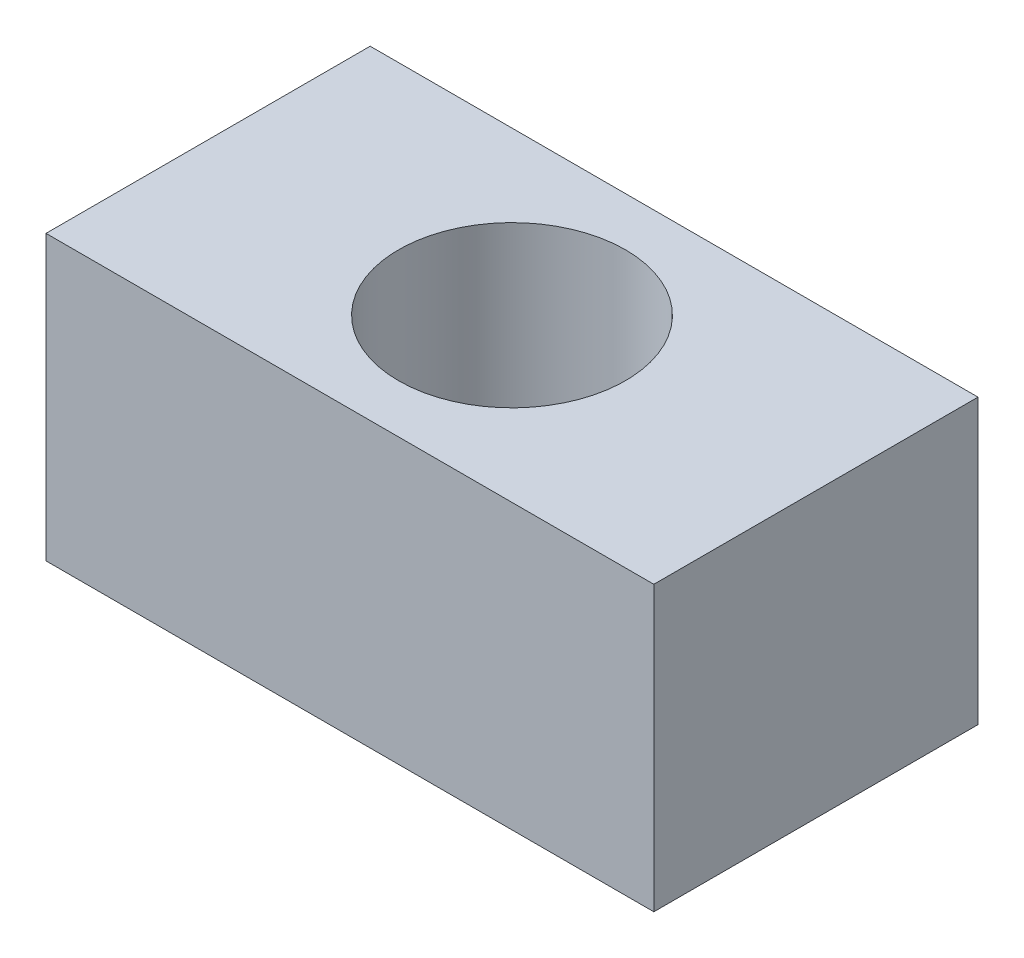
ISO-10303-21;
HEADER;
FILE_DESCRIPTION(('STEP AP214'),'2;1');
FILE_NAME('part.step','',(''),(''),'','','');
FILE_SCHEMA(('AUTOMOTIVE_DESIGN { 1 0 10303 214 1 1 1 1 }'));
ENDSEC;
DATA;
#1=APPLICATION_CONTEXT('core data for automotive mechanical design processes');
#2=APPLICATION_PROTOCOL_DEFINITION('international standard','automotive_design',2000,#1);
#3=PRODUCT_CONTEXT('',#1,'mechanical');
#4=PRODUCT('Part','Part','',(#3));
#5=PRODUCT_RELATED_PRODUCT_CATEGORY('part','',(#4));
#6=PRODUCT_DEFINITION_FORMATION('','',#4);
#7=PRODUCT_DEFINITION_CONTEXT('part definition',#1,'design');
#8=PRODUCT_DEFINITION('design','',#6,#7);
#9=PRODUCT_DEFINITION_SHAPE('','',#8);
#10=(LENGTH_UNIT() NAMED_UNIT(*) SI_UNIT(.MILLI.,.METRE.));
#11=(NAMED_UNIT(*) PLANE_ANGLE_UNIT() SI_UNIT($,.RADIAN.));
#12=(NAMED_UNIT(*) SI_UNIT($,.STERADIAN.) SOLID_ANGLE_UNIT());
#13=UNCERTAINTY_MEASURE_WITH_UNIT(LENGTH_MEASURE(1.E-05),#10,'distance_accuracy_value','');
#14=(GEOMETRIC_REPRESENTATION_CONTEXT(3) GLOBAL_UNCERTAINTY_ASSIGNED_CONTEXT((#13)) GLOBAL_UNIT_ASSIGNED_CONTEXT((#10,
#11,#12)) REPRESENTATION_CONTEXT('',''));
#15=CARTESIAN_POINT('',(0.,0.,0.));
#16=DIRECTION('',(0.,0.,1.));
#17=DIRECTION('',(1.,0.,0.));
#18=AXIS2_PLACEMENT_3D('',#15,#16,#17);
#19=CARTESIAN_POINT('',(-53.2998784933171,35.,24.3332928311057));
#20=DIRECTION('',(1.,0.,0.));
#21=DIRECTION('',(0.,0.,-1.));
#22=AXIS2_PLACEMENT_3D('',#19,#20,#21);
#23=PLANE('',#22);
#24=DIRECTION('',(0.,0.,1.));
#25=VECTOR('',#24,1.);
#26=CARTESIAN_POINT('',(-53.2998784933171,0.,24.3332928311057));
#27=LINE('',#26,#25);
#28=CARTESIAN_POINT('',(-53.2998784933171,0.,24.3332928311057));
#29=VERTEX_POINT('',#28);
#30=CARTESIAN_POINT('',(-53.2998784933171,0.,64.3332928311057));
#31=VERTEX_POINT('',#30);
#32=EDGE_CURVE('E103',#29,#31,#27,.T.);
#33=ORIENTED_EDGE('',*,*,#32,.T.);
#34=DIRECTION('',(0.,-1.,0.));
#35=VECTOR('',#34,1.);
#36=CARTESIAN_POINT('',(-53.2998784933171,35.,64.3332928311057));
#37=LINE('',#36,#35);
#38=CARTESIAN_POINT('',(-53.2998784933171,35.,64.3332928311057));
#39=VERTEX_POINT('',#38);
#40=EDGE_CURVE('E11',#39,#31,#37,.T.);
#41=ORIENTED_EDGE('',*,*,#40,.F.);
#42=DIRECTION('',(0.,0.,1.));
#43=VECTOR('',#42,1.);
#44=CARTESIAN_POINT('',(-53.2998784933171,35.,24.3332928311057));
#45=LINE('',#44,#43);
#46=CARTESIAN_POINT('',(-53.2998784933171,35.,24.3332928311057));
#47=VERTEX_POINT('',#46);
#48=EDGE_CURVE('E89',#47,#39,#45,.T.);
#49=ORIENTED_EDGE('',*,*,#48,.F.);
#50=DIRECTION('',(0.,-1.,0.));
#51=VECTOR('',#50,1.);
#52=CARTESIAN_POINT('',(-53.2998784933171,35.,24.3332928311057));
#53=LINE('',#52,#51);
#54=EDGE_CURVE('E56',#47,#29,#53,.T.);
#55=ORIENTED_EDGE('',*,*,#54,.T.);
#56=EDGE_LOOP('',(#33,#41,#49,#55));
#57=FACE_BOUND('',#56,.T.);
#58=ADVANCED_FACE('F40',(#57),#23,.F.);
#59=CARTESIAN_POINT('',(-53.2998784933171,35.,64.3332928311057));
#60=DIRECTION('',(0.,0.,-1.));
#61=DIRECTION('',(-1.,0.,0.));
#62=AXIS2_PLACEMENT_3D('',#59,#60,#61);
#63=PLANE('',#62);
#64=DIRECTION('',(1.,0.,0.));
#65=VECTOR('',#64,1.);
#66=CARTESIAN_POINT('',(-53.2998784933171,0.,64.3332928311057));
#67=LINE('',#66,#65);
#68=CARTESIAN_POINT('',(21.7001215066829,0.,64.3332928311057));
#69=VERTEX_POINT('',#68);
#70=EDGE_CURVE('E94',#31,#69,#67,.T.);
#71=ORIENTED_EDGE('',*,*,#70,.T.);
#72=DIRECTION('',(0.,-1.,0.));
#73=VECTOR('',#72,1.);
#74=CARTESIAN_POINT('',(21.7001215066829,35.,64.3332928311057));
#75=LINE('',#74,#73);
#76=CARTESIAN_POINT('',(21.7001215066829,35.,64.3332928311057));
#77=VERTEX_POINT('',#76);
#78=EDGE_CURVE('E48',#77,#69,#75,.T.);
#79=ORIENTED_EDGE('',*,*,#78,.F.);
#80=DIRECTION('',(1.,0.,0.));
#81=VECTOR('',#80,1.);
#82=CARTESIAN_POINT('',(-53.2998784933171,35.,64.3332928311057));
#83=LINE('',#82,#81);
#84=EDGE_CURVE('E81',#39,#77,#83,.T.);
#85=ORIENTED_EDGE('',*,*,#84,.F.);
#86=ORIENTED_EDGE('',*,*,#40,.T.);
#87=EDGE_LOOP('',(#71,#79,#85,#86));
#88=FACE_BOUND('',#87,.T.);
#89=ADVANCED_FACE('F93',(#88),#63,.F.);
#90=CARTESIAN_POINT('',(21.7001215066829,35.,24.3332928311057));
#91=DIRECTION('',(1.,0.,0.));
#92=DIRECTION('',(0.,0.,-1.));
#93=AXIS2_PLACEMENT_3D('',#90,#91,#92);
#94=PLANE('',#93);
#95=DIRECTION('',(0.,0.,1.));
#96=VECTOR('',#95,1.);
#97=CARTESIAN_POINT('',(21.7001215066829,0.,24.3332928311057));
#98=LINE('',#97,#96);
#99=CARTESIAN_POINT('',(21.7001215066829,0.,24.3332928311057));
#100=VERTEX_POINT('',#99);
#101=EDGE_CURVE('E107',#100,#69,#98,.T.);
#102=ORIENTED_EDGE('',*,*,#101,.F.);
#103=DIRECTION('',(0.,-1.,0.));
#104=VECTOR('',#103,1.);
#105=CARTESIAN_POINT('',(21.7001215066829,35.,24.3332928311057));
#106=LINE('',#105,#104);
#107=CARTESIAN_POINT('',(21.7001215066829,35.,24.3332928311057));
#108=VERTEX_POINT('',#107);
#109=EDGE_CURVE('E70',#108,#100,#106,.T.);
#110=ORIENTED_EDGE('',*,*,#109,.F.);
#111=DIRECTION('',(0.,0.,1.));
#112=VECTOR('',#111,1.);
#113=CARTESIAN_POINT('',(21.7001215066829,35.,24.3332928311057));
#114=LINE('',#113,#112);
#115=EDGE_CURVE('E88',#108,#77,#114,.T.);
#116=ORIENTED_EDGE('',*,*,#115,.T.);
#117=ORIENTED_EDGE('',*,*,#78,.T.);
#118=EDGE_LOOP('',(#102,#110,#116,#117));
#119=FACE_BOUND('',#118,.T.);
#120=ADVANCED_FACE('F97',(#119),#94,.T.);
#121=CARTESIAN_POINT('',(-53.2998784933171,35.,24.3332928311057));
#122=DIRECTION('',(0.,0.,-1.));
#123=DIRECTION('',(-1.,0.,0.));
#124=AXIS2_PLACEMENT_3D('',#121,#122,#123);
#125=PLANE('',#124);
#126=DIRECTION('',(1.,0.,0.));
#127=VECTOR('',#126,1.);
#128=CARTESIAN_POINT('',(-53.2998784933171,0.,24.3332928311057));
#129=LINE('',#128,#127);
#130=EDGE_CURVE('E109',#29,#100,#129,.T.);
#131=ORIENTED_EDGE('',*,*,#130,.F.);
#132=ORIENTED_EDGE('',*,*,#54,.F.);
#133=DIRECTION('',(1.,0.,0.));
#134=VECTOR('',#133,1.);
#135=CARTESIAN_POINT('',(-53.2998784933171,35.,24.3332928311057));
#136=LINE('',#135,#134);
#137=EDGE_CURVE('E98',#47,#108,#136,.T.);
#138=ORIENTED_EDGE('',*,*,#137,.T.);
#139=ORIENTED_EDGE('',*,*,#109,.T.);
#140=EDGE_LOOP('',(#131,#132,#138,#139));
#141=FACE_BOUND('',#140,.T.);
#142=ADVANCED_FACE('F126',(#141),#125,.T.);
#143=CARTESIAN_POINT('',(0.,35.,0.));
#144=DIRECTION('',(0.,1.,0.));
#145=DIRECTION('',(0.,0.,1.));
#146=AXIS2_PLACEMENT_3D('',#143,#144,#145);
#147=PLANE('',#146);
#148=CARTESIAN_POINT('',(-15.7998784933171,35.,44.3332928311057));
#149=DIRECTION('',(0.,1.,0.));
#150=DIRECTION('',(0.,0.,1.));
#151=AXIS2_PLACEMENT_3D('',#148,#149,#150);
#152=CIRCLE('',#151,14.);
#153=CARTESIAN_POINT('',(-15.7998784933171,35.,58.3332928311057));
#154=VERTEX_POINT('',#153);
#155=EDGE_CURVE('E105',#154,#154,#152,.T.);
#156=ORIENTED_EDGE('',*,*,#155,.F.);
#157=EDGE_LOOP('',(#156));
#158=FACE_BOUND('',#157,.T.);
#159=ORIENTED_EDGE('',*,*,#48,.T.);
#160=ORIENTED_EDGE('',*,*,#84,.T.);
#161=ORIENTED_EDGE('',*,*,#115,.F.);
#162=ORIENTED_EDGE('',*,*,#137,.F.);
#163=EDGE_LOOP('',(#159,#160,#161,#162));
#164=FACE_BOUND('',#163,.T.);
#165=ADVANCED_FACE('F85',(#158,#164),#147,.T.);
#166=CARTESIAN_POINT('',(0.,0.,0.));
#167=DIRECTION('',(0.,1.,0.));
#168=DIRECTION('',(0.,0.,1.));
#169=AXIS2_PLACEMENT_3D('',#166,#167,#168);
#170=PLANE('',#169);
#171=CARTESIAN_POINT('',(-15.7998784933171,0.,44.3332928311057));
#172=DIRECTION('',(0.,1.,0.));
#173=DIRECTION('',(0.,0.,1.));
#174=AXIS2_PLACEMENT_3D('',#171,#172,#173);
#175=CIRCLE('',#174,14.);
#176=CARTESIAN_POINT('',(-15.7998784933171,0.,58.3332928311057));
#177=VERTEX_POINT('',#176);
#178=EDGE_CURVE('E115',#177,#177,#175,.T.);
#179=ORIENTED_EDGE('',*,*,#178,.T.);
#180=EDGE_LOOP('',(#179));
#181=FACE_BOUND('',#180,.T.);
#182=ORIENTED_EDGE('',*,*,#32,.F.);
#183=ORIENTED_EDGE('',*,*,#130,.T.);
#184=ORIENTED_EDGE('',*,*,#101,.T.);
#185=ORIENTED_EDGE('',*,*,#70,.F.);
#186=EDGE_LOOP('',(#182,#183,#184,#185));
#187=FACE_BOUND('',#186,.T.);
#188=ADVANCED_FACE('F125',(#181,#187),#170,.F.);
#189=CARTESIAN_POINT('',(-15.7998784933171,35.,44.3332928311057));
#190=DIRECTION('',(0.,-1.,0.));
#191=DIRECTION('',(0.,0.,-1.));
#192=AXIS2_PLACEMENT_3D('',#189,#190,#191);
#193=CYLINDRICAL_SURFACE('',#192,14.);
#194=ORIENTED_EDGE('',*,*,#155,.T.);
#195=EDGE_LOOP('',(#194));
#196=FACE_BOUND('',#195,.T.);
#197=ORIENTED_EDGE('',*,*,#178,.F.);
#198=EDGE_LOOP('',(#197));
#199=FACE_BOUND('',#198,.T.);
#200=ADVANCED_FACE('F121',(#196,#199),#193,.F.);
#201=CLOSED_SHELL('',(#58,#89,#120,#142,#165,#188,#200));
#202=MANIFOLD_SOLID_BREP('B2',#201);
#203=ADVANCED_BREP_SHAPE_REPRESENTATION('',(#18,#202),#14);
#204=SHAPE_DEFINITION_REPRESENTATION(#9,#203);
ENDSEC;
END-ISO-10303-21;
